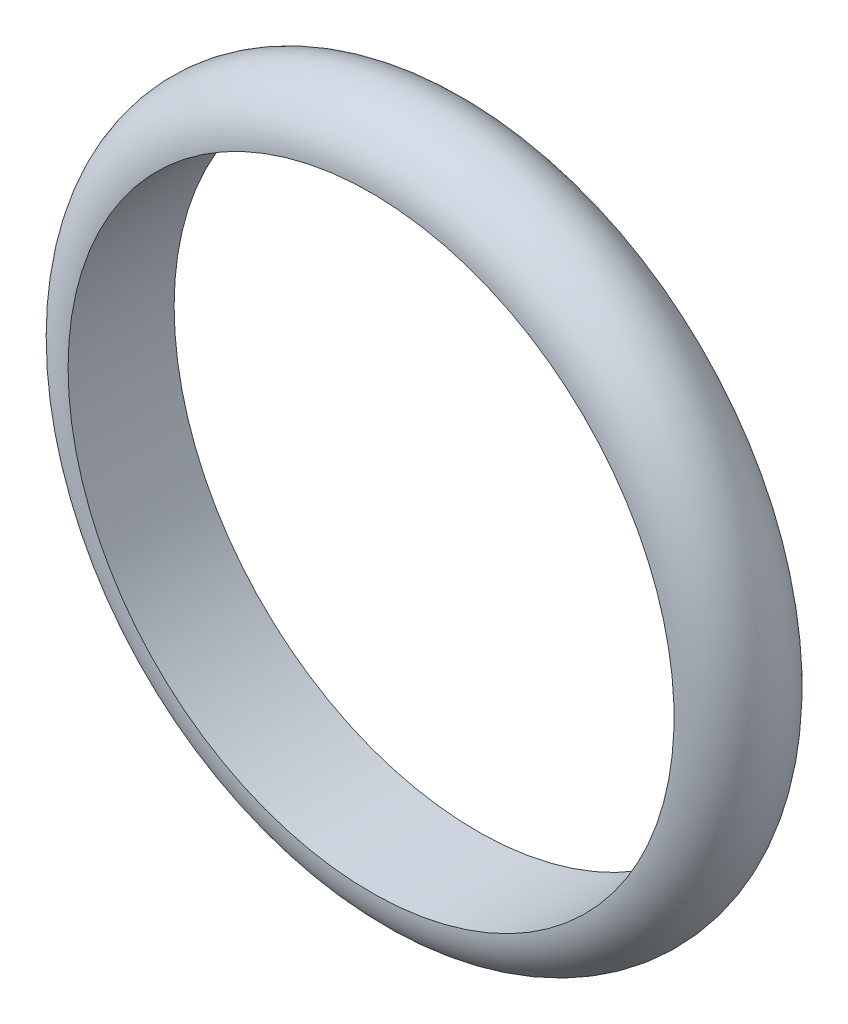
ISO-10303-21;
HEADER;
FILE_DESCRIPTION(('STEP AP214'),'2;1');
FILE_NAME('part.step','',(''),(''),'','','');
FILE_SCHEMA(('AUTOMOTIVE_DESIGN { 1 0 10303 214 1 1 1 1 }'));
ENDSEC;
DATA;
#1=APPLICATION_CONTEXT('core data for automotive mechanical design processes');
#2=APPLICATION_PROTOCOL_DEFINITION('international standard','automotive_design',2000,#1);
#3=PRODUCT_CONTEXT('',#1,'mechanical');
#4=PRODUCT('Part','Part','',(#3));
#5=PRODUCT_RELATED_PRODUCT_CATEGORY('part','',(#4));
#6=PRODUCT_DEFINITION_FORMATION('','',#4);
#7=PRODUCT_DEFINITION_CONTEXT('part definition',#1,'design');
#8=PRODUCT_DEFINITION('design','',#6,#7);
#9=PRODUCT_DEFINITION_SHAPE('','',#8);
#10=(LENGTH_UNIT() NAMED_UNIT(*) SI_UNIT(.MILLI.,.METRE.));
#11=(NAMED_UNIT(*) PLANE_ANGLE_UNIT() SI_UNIT($,.RADIAN.));
#12=(NAMED_UNIT(*) SI_UNIT($,.STERADIAN.) SOLID_ANGLE_UNIT());
#13=UNCERTAINTY_MEASURE_WITH_UNIT(LENGTH_MEASURE(1.E-05),#10,'distance_accuracy_value','');
#14=(GEOMETRIC_REPRESENTATION_CONTEXT(3) GLOBAL_UNCERTAINTY_ASSIGNED_CONTEXT((#13)) GLOBAL_UNIT_ASSIGNED_CONTEXT((#10,
#11,#12)) REPRESENTATION_CONTEXT('',''));
#15=CARTESIAN_POINT('',(0.,0.,0.));
#16=DIRECTION('',(0.,0.,1.));
#17=DIRECTION('',(1.,0.,0.));
#18=AXIS2_PLACEMENT_3D('',#15,#16,#17);
#19=CARTESIAN_POINT('',(0.,0.,-37.75));
#20=DIRECTION('',(0.,0.,1.));
#21=DIRECTION('',(1.,0.,0.));
#22=AXIS2_PLACEMENT_3D('',#19,#20,#21);
#23=CYLINDRICAL_SURFACE('',#22,30.);
#24=CARTESIAN_POINT('',(0.,0.,8.75000000000001));
#25=DIRECTION('',(0.,0.,-1.));
#26=DIRECTION('',(-1.,0.,0.));
#27=AXIS2_PLACEMENT_3D('',#24,#25,#26);
#28=CIRCLE('',#27,30.);
#29=CARTESIAN_POINT('',(-30.,0.,8.75000000000001));
#30=VERTEX_POINT('',#29);
#31=EDGE_CURVE('E10',#30,#30,#28,.T.);
#32=ORIENTED_EDGE('',*,*,#31,.F.);
#33=EDGE_LOOP('',(#32));
#34=FACE_BOUND('',#33,.T.);
#35=CARTESIAN_POINT('',(0.,0.,-1.74999999999999));
#36=DIRECTION('',(0.,0.,-1.));
#37=DIRECTION('',(-1.,0.,0.));
#38=AXIS2_PLACEMENT_3D('',#35,#36,#37);
#39=CIRCLE('',#38,30.);
#40=CARTESIAN_POINT('',(-30.,0.,-1.74999999999999));
#41=VERTEX_POINT('',#40);
#42=EDGE_CURVE('E44',#41,#41,#39,.T.);
#43=ORIENTED_EDGE('',*,*,#42,.T.);
#44=EDGE_LOOP('',(#43));
#45=FACE_BOUND('',#44,.T.);
#46=ADVANCED_FACE('F37',(#34,#45),#23,.F.);
#47=CARTESIAN_POINT('',(0.,0.,3.50000000000001));
#48=DIRECTION('',(0.,0.,-1.));
#49=DIRECTION('',(-1.,0.,0.));
#50=AXIS2_PLACEMENT_3D('',#47,#48,#49);
#51=TOROIDAL_SURFACE('',#50,30.,5.25);
#52=ORIENTED_EDGE('',*,*,#31,.T.);
#53=EDGE_LOOP('',(#52));
#54=FACE_BOUND('',#53,.T.);
#55=ORIENTED_EDGE('',*,*,#42,.F.);
#56=EDGE_LOOP('',(#55));
#57=FACE_BOUND('',#56,.T.);
#58=ADVANCED_FACE('F52',(#54,#57),#51,.T.);
#59=CLOSED_SHELL('',(#46,#58));
#60=MANIFOLD_SOLID_BREP('B2',#59);
#61=ADVANCED_BREP_SHAPE_REPRESENTATION('',(#18,#60),#14);
#62=SHAPE_DEFINITION_REPRESENTATION(#9,#61);
ENDSEC;
END-ISO-10303-21;
